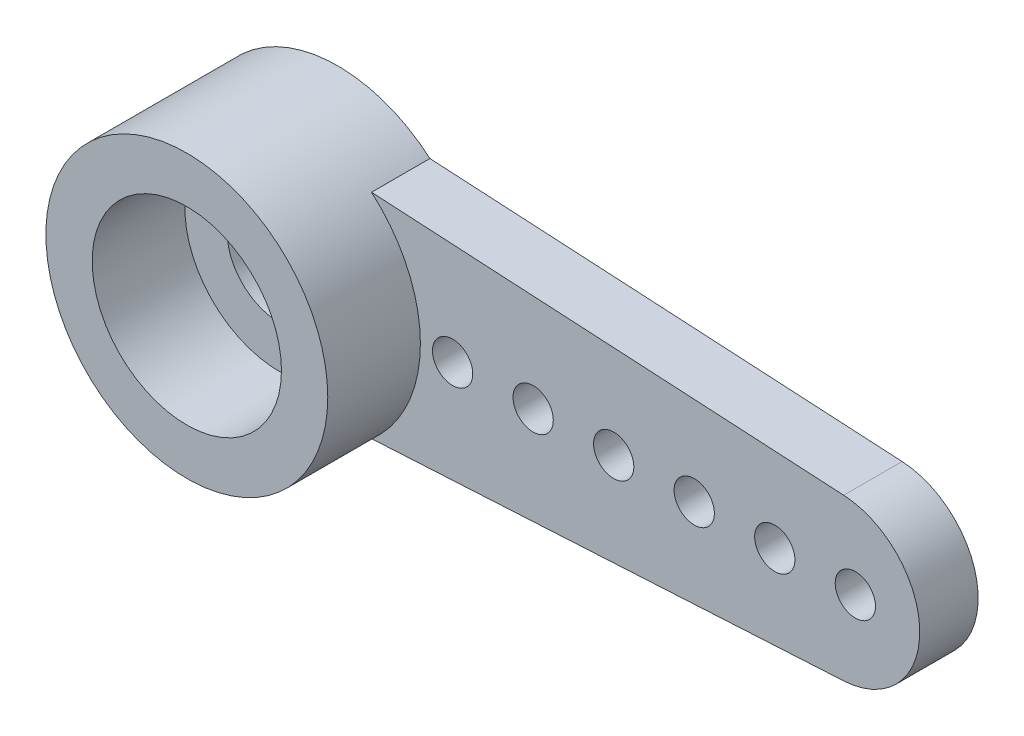
ISO-10303-21;
HEADER;
FILE_DESCRIPTION(('STEP AP214'),'2;1');
FILE_NAME('part.step','',(''),(''),'','','');
FILE_SCHEMA(('AUTOMOTIVE_DESIGN { 1 0 10303 214 1 1 1 1 }'));
ENDSEC;
DATA;
#1=APPLICATION_CONTEXT('core data for automotive mechanical design processes');
#2=APPLICATION_PROTOCOL_DEFINITION('international standard','automotive_design',2000,#1);
#3=PRODUCT_CONTEXT('',#1,'mechanical');
#4=PRODUCT('Part','Part','',(#3));
#5=PRODUCT_RELATED_PRODUCT_CATEGORY('part','',(#4));
#6=PRODUCT_DEFINITION_FORMATION('','',#4);
#7=PRODUCT_DEFINITION_CONTEXT('part definition',#1,'design');
#8=PRODUCT_DEFINITION('design','',#6,#7);
#9=PRODUCT_DEFINITION_SHAPE('','',#8);
#10=(LENGTH_UNIT() NAMED_UNIT(*) SI_UNIT(.MILLI.,.METRE.));
#11=(NAMED_UNIT(*) PLANE_ANGLE_UNIT() SI_UNIT($,.RADIAN.));
#12=(NAMED_UNIT(*) SI_UNIT($,.STERADIAN.) SOLID_ANGLE_UNIT());
#13=UNCERTAINTY_MEASURE_WITH_UNIT(LENGTH_MEASURE(1.E-05),#10,'distance_accuracy_value','');
#14=(GEOMETRIC_REPRESENTATION_CONTEXT(3) GLOBAL_UNCERTAINTY_ASSIGNED_CONTEXT((#13)) GLOBAL_UNIT_ASSIGNED_CONTEXT((#10,
#11,#12)) REPRESENTATION_CONTEXT('',''));
#15=CARTESIAN_POINT('',(0.,0.,0.));
#16=DIRECTION('',(0.,0.,1.));
#17=DIRECTION('',(1.,0.,0.));
#18=AXIS2_PLACEMENT_3D('',#15,#16,#17);
#19=CARTESIAN_POINT('',(4.3,0.,3.75));
#20=DIRECTION('',(0.,0.,-1.));
#21=DIRECTION('',(-1.,0.,0.));
#22=AXIS2_PLACEMENT_3D('',#19,#20,#21);
#23=CYLINDRICAL_SURFACE('',#22,0.500000000000001);
#24=CARTESIAN_POINT('',(4.3,0.,1.45));
#25=DIRECTION('',(0.,0.,1.));
#26=DIRECTION('',(1.,0.,0.));
#27=AXIS2_PLACEMENT_3D('',#24,#25,#26);
#28=CIRCLE('',#27,0.500000000000001);
#29=CARTESIAN_POINT('',(4.8,0.,1.45));
#30=VERTEX_POINT('',#29);
#31=EDGE_CURVE('E45',#30,#30,#28,.T.);
#32=ORIENTED_EDGE('',*,*,#31,.T.);
#33=EDGE_LOOP('',(#32));
#34=FACE_BOUND('',#33,.T.);
#35=CARTESIAN_POINT('',(4.3,0.,0.));
#36=DIRECTION('',(0.,0.,-1.));
#37=DIRECTION('',(-1.,0.,0.));
#38=AXIS2_PLACEMENT_3D('',#35,#36,#37);
#39=CIRCLE('',#38,0.500000000000001);
#40=CARTESIAN_POINT('',(3.8,0.,0.));
#41=VERTEX_POINT('',#40);
#42=EDGE_CURVE('E11',#41,#41,#39,.T.);
#43=ORIENTED_EDGE('',*,*,#42,.T.);
#44=EDGE_LOOP('',(#43));
#45=FACE_BOUND('',#44,.T.);
#46=ADVANCED_FACE('F37',(#34,#45),#23,.F.);
#47=CARTESIAN_POINT('',(6.3,0.,3.75));
#48=DIRECTION('',(0.,0.,-1.));
#49=DIRECTION('',(-1.,0.,0.));
#50=AXIS2_PLACEMENT_3D('',#47,#48,#49);
#51=CYLINDRICAL_SURFACE('',#50,0.500000000000001);
#52=CARTESIAN_POINT('',(6.3,0.,1.45));
#53=DIRECTION('',(0.,0.,1.));
#54=DIRECTION('',(1.,0.,0.));
#55=AXIS2_PLACEMENT_3D('',#52,#53,#54);
#56=CIRCLE('',#55,0.500000000000001);
#57=CARTESIAN_POINT('',(6.8,0.,1.45));
#58=VERTEX_POINT('',#57);
#59=EDGE_CURVE('E133',#58,#58,#56,.T.);
#60=ORIENTED_EDGE('',*,*,#59,.T.);
#61=EDGE_LOOP('',(#60));
#62=FACE_BOUND('',#61,.T.);
#63=CARTESIAN_POINT('',(6.3,0.,0.));
#64=DIRECTION('',(0.,0.,-1.));
#65=DIRECTION('',(-1.,0.,0.));
#66=AXIS2_PLACEMENT_3D('',#63,#64,#65);
#67=CIRCLE('',#66,0.500000000000001);
#68=CARTESIAN_POINT('',(5.8,0.,0.));
#69=VERTEX_POINT('',#68);
#70=EDGE_CURVE('E136',#69,#69,#67,.T.);
#71=ORIENTED_EDGE('',*,*,#70,.T.);
#72=EDGE_LOOP('',(#71));
#73=FACE_BOUND('',#72,.T.);
#74=ADVANCED_FACE('F165',(#62,#73),#51,.F.);
#75=CARTESIAN_POINT('',(8.3,0.,3.75));
#76=DIRECTION('',(0.,0.,-1.));
#77=DIRECTION('',(-1.,0.,0.));
#78=AXIS2_PLACEMENT_3D('',#75,#76,#77);
#79=CYLINDRICAL_SURFACE('',#78,0.500000000000001);
#80=CARTESIAN_POINT('',(8.3,0.,1.45));
#81=DIRECTION('',(0.,0.,1.));
#82=DIRECTION('',(1.,0.,0.));
#83=AXIS2_PLACEMENT_3D('',#80,#81,#82);
#84=CIRCLE('',#83,0.500000000000001);
#85=CARTESIAN_POINT('',(8.8,0.,1.45));
#86=VERTEX_POINT('',#85);
#87=EDGE_CURVE('E127',#86,#86,#84,.T.);
#88=ORIENTED_EDGE('',*,*,#87,.T.);
#89=EDGE_LOOP('',(#88));
#90=FACE_BOUND('',#89,.T.);
#91=CARTESIAN_POINT('',(8.3,0.,0.));
#92=DIRECTION('',(0.,0.,-1.));
#93=DIRECTION('',(-1.,0.,0.));
#94=AXIS2_PLACEMENT_3D('',#91,#92,#93);
#95=CIRCLE('',#94,0.500000000000001);
#96=CARTESIAN_POINT('',(7.8,0.,0.));
#97=VERTEX_POINT('',#96);
#98=EDGE_CURVE('E130',#97,#97,#95,.T.);
#99=ORIENTED_EDGE('',*,*,#98,.T.);
#100=EDGE_LOOP('',(#99));
#101=FACE_BOUND('',#100,.T.);
#102=ADVANCED_FACE('F169',(#90,#101),#79,.F.);
#103=CARTESIAN_POINT('',(10.3,0.,3.75));
#104=DIRECTION('',(0.,0.,-1.));
#105=DIRECTION('',(-1.,0.,0.));
#106=AXIS2_PLACEMENT_3D('',#103,#104,#105);
#107=CYLINDRICAL_SURFACE('',#106,0.500000000000001);
#108=CARTESIAN_POINT('',(10.3,0.,1.45));
#109=DIRECTION('',(0.,0.,1.));
#110=DIRECTION('',(1.,0.,0.));
#111=AXIS2_PLACEMENT_3D('',#108,#109,#110);
#112=CIRCLE('',#111,0.500000000000001);
#113=CARTESIAN_POINT('',(10.8,0.,1.45));
#114=VERTEX_POINT('',#113);
#115=EDGE_CURVE('E96',#114,#114,#112,.T.);
#116=ORIENTED_EDGE('',*,*,#115,.T.);
#117=EDGE_LOOP('',(#116));
#118=FACE_BOUND('',#117,.T.);
#119=CARTESIAN_POINT('',(10.3,0.,0.));
#120=DIRECTION('',(0.,0.,-1.));
#121=DIRECTION('',(-1.,0.,0.));
#122=AXIS2_PLACEMENT_3D('',#119,#120,#121);
#123=CIRCLE('',#122,0.500000000000001);
#124=CARTESIAN_POINT('',(9.8,0.,0.));
#125=VERTEX_POINT('',#124);
#126=EDGE_CURVE('E99',#125,#125,#123,.T.);
#127=ORIENTED_EDGE('',*,*,#126,.T.);
#128=EDGE_LOOP('',(#127));
#129=FACE_BOUND('',#128,.T.);
#130=ADVANCED_FACE('F174',(#118,#129),#107,.F.);
#131=CARTESIAN_POINT('',(0.,0.,1.45));
#132=DIRECTION('',(0.,0.,-1.));
#133=DIRECTION('',(-1.,0.,0.));
#134=AXIS2_PLACEMENT_3D('',#131,#132,#133);
#135=CYLINDRICAL_SURFACE('',#134,3.5);
#136=CARTESIAN_POINT('',(0.,0.,0.));
#137=DIRECTION('',(0.,0.,1.));
#138=DIRECTION('',(1.,0.,0.));
#139=AXIS2_PLACEMENT_3D('',#136,#137,#138);
#140=CIRCLE('',#139,3.5);
#141=CARTESIAN_POINT('',(2.28637267303473,2.65,0.));
#142=VERTEX_POINT('',#141);
#143=CARTESIAN_POINT('',(2.28637267303473,-2.65,0.));
#144=VERTEX_POINT('',#143);
#145=EDGE_CURVE('E110',#142,#144,#140,.T.);
#146=ORIENTED_EDGE('',*,*,#145,.T.);
#147=DIRECTION('',(0.,0.,-1.));
#148=VECTOR('',#147,1.);
#149=CARTESIAN_POINT('',(2.28637267303473,-2.65,1.45));
#150=LINE('',#149,#148);
#151=CARTESIAN_POINT('',(2.28637267303473,-2.65,1.45));
#152=VERTEX_POINT('',#151);
#153=EDGE_CURVE('E94',#152,#144,#150,.T.);
#154=ORIENTED_EDGE('',*,*,#153,.F.);
#155=CARTESIAN_POINT('',(0.,0.,1.45));
#156=DIRECTION('',(0.,0.,1.));
#157=DIRECTION('',(1.,0.,0.));
#158=AXIS2_PLACEMENT_3D('',#155,#156,#157);
#159=CIRCLE('',#158,3.5);
#160=CARTESIAN_POINT('',(2.28637267303473,2.65,1.45));
#161=VERTEX_POINT('',#160);
#162=EDGE_CURVE('E81',#152,#161,#159,.T.);
#163=ORIENTED_EDGE('',*,*,#162,.T.);
#164=DIRECTION('',(0.,0.,-1.));
#165=VECTOR('',#164,1.);
#166=CARTESIAN_POINT('',(2.28637267303473,2.65,1.45));
#167=LINE('',#166,#165);
#168=EDGE_CURVE('E78',#161,#142,#167,.T.);
#169=ORIENTED_EDGE('',*,*,#168,.T.);
#170=EDGE_LOOP('',(#146,#154,#163,#169));
#171=FACE_BOUND('',#170,.T.);
#172=CARTESIAN_POINT('',(0.,0.,3.75));
#173=DIRECTION('',(0.,0.,1.));
#174=DIRECTION('',(1.,0.,0.));
#175=AXIS2_PLACEMENT_3D('',#172,#173,#174);
#176=CIRCLE('',#175,3.5);
#177=CARTESIAN_POINT('',(3.5,0.,3.75));
#178=VERTEX_POINT('',#177);
#179=EDGE_CURVE('E105',#178,#178,#176,.T.);
#180=ORIENTED_EDGE('',*,*,#179,.F.);
#181=EDGE_LOOP('',(#180));
#182=FACE_BOUND('',#181,.T.);
#183=ADVANCED_FACE('F92',(#171,#182),#135,.T.);
#184=CARTESIAN_POINT('',(0.154225106367269,-2.7687644147367,1.45));
#185=DIRECTION('',(0.0556155679583172,-0.998452256545436,0.));
#186=DIRECTION('',(0.998452256545436,0.0556155679583172,0.));
#187=AXIS2_PLACEMENT_3D('',#184,#185,#186);
#188=PLANE('',#187);
#189=DIRECTION('',(-0.998452256545436,-0.0556155679583172,0.));
#190=VECTOR('',#189,1.);
#191=CARTESIAN_POINT('',(0.154225106367269,-2.7687644147367,0.));
#192=LINE('',#191,#190);
#193=CARTESIAN_POINT('',(14.0112311359166,-1.99690451309087,0.));
#194=VERTEX_POINT('',#193);
#195=EDGE_CURVE('E112',#194,#144,#192,.T.);
#196=ORIENTED_EDGE('',*,*,#195,.F.);
#197=DIRECTION('',(0.,0.,-1.));
#198=VECTOR('',#197,1.);
#199=CARTESIAN_POINT('',(14.0112311359166,-1.99690451309087,1.45));
#200=LINE('',#199,#198);
#201=CARTESIAN_POINT('',(14.0112311359166,-1.99690451309087,1.45));
#202=VERTEX_POINT('',#201);
#203=EDGE_CURVE('E101',#202,#194,#200,.T.);
#204=ORIENTED_EDGE('',*,*,#203,.F.);
#205=DIRECTION('',(-0.998452256545436,-0.0556155679583172,0.));
#206=VECTOR('',#205,1.);
#207=CARTESIAN_POINT('',(0.154225106367269,-2.7687644147367,1.45));
#208=LINE('',#207,#206);
#209=EDGE_CURVE('E107',#202,#152,#208,.T.);
#210=ORIENTED_EDGE('',*,*,#209,.T.);
#211=ORIENTED_EDGE('',*,*,#153,.T.);
#212=EDGE_LOOP('',(#196,#204,#210,#211));
#213=FACE_BOUND('',#212,.T.);
#214=ADVANCED_FACE('F184',(#213),#188,.T.);
#215=CARTESIAN_POINT('',(13.9,0.,1.45));
#216=DIRECTION('',(0.,0.,-1.));
#217=DIRECTION('',(-1.,0.,0.));
#218=AXIS2_PLACEMENT_3D('',#215,#216,#217);
#219=CYLINDRICAL_SURFACE('',#218,2.);
#220=CARTESIAN_POINT('',(13.9,0.,0.));
#221=DIRECTION('',(0.,0.,1.));
#222=DIRECTION('',(1.,0.,0.));
#223=AXIS2_PLACEMENT_3D('',#220,#221,#222);
#224=CIRCLE('',#223,2.);
#225=CARTESIAN_POINT('',(14.0112311359166,1.99690451309087,0.));
#226=VERTEX_POINT('',#225);
#227=EDGE_CURVE('E115',#194,#226,#224,.T.);
#228=ORIENTED_EDGE('',*,*,#227,.T.);
#229=DIRECTION('',(0.,0.,-1.));
#230=VECTOR('',#229,1.);
#231=CARTESIAN_POINT('',(14.0112311359166,1.99690451309087,1.45));
#232=LINE('',#231,#230);
#233=CARTESIAN_POINT('',(14.0112311359166,1.99690451309087,1.45));
#234=VERTEX_POINT('',#233);
#235=EDGE_CURVE('E71',#234,#226,#232,.T.);
#236=ORIENTED_EDGE('',*,*,#235,.F.);
#237=CARTESIAN_POINT('',(13.9,0.,1.45));
#238=DIRECTION('',(0.,0.,1.));
#239=DIRECTION('',(1.,0.,0.));
#240=AXIS2_PLACEMENT_3D('',#237,#238,#239);
#241=CIRCLE('',#240,2.);
#242=EDGE_CURVE('E53',#202,#234,#241,.T.);
#243=ORIENTED_EDGE('',*,*,#242,.F.);
#244=ORIENTED_EDGE('',*,*,#203,.T.);
#245=EDGE_LOOP('',(#228,#236,#243,#244));
#246=FACE_BOUND('',#245,.T.);
#247=ADVANCED_FACE('F155',(#246),#219,.T.);
#248=CARTESIAN_POINT('',(0.154225106367269,2.7687644147367,1.45));
#249=DIRECTION('',(0.0556155679583172,0.998452256545436,0.));
#250=DIRECTION('',(-0.998452256545436,0.0556155679583172,0.));
#251=AXIS2_PLACEMENT_3D('',#248,#249,#250);
#252=PLANE('',#251);
#253=DIRECTION('',(0.998452256545436,-0.0556155679583172,0.));
#254=VECTOR('',#253,1.);
#255=CARTESIAN_POINT('',(0.154225106367269,2.7687644147367,0.));
#256=LINE('',#255,#254);
#257=EDGE_CURVE('E90',#142,#226,#256,.T.);
#258=ORIENTED_EDGE('',*,*,#257,.F.);
#259=ORIENTED_EDGE('',*,*,#168,.F.);
#260=DIRECTION('',(0.998452256545436,-0.0556155679583172,0.));
#261=VECTOR('',#260,1.);
#262=CARTESIAN_POINT('',(0.154225106367269,2.7687644147367,1.45));
#263=LINE('',#262,#261);
#264=EDGE_CURVE('E84',#161,#234,#263,.T.);
#265=ORIENTED_EDGE('',*,*,#264,.T.);
#266=ORIENTED_EDGE('',*,*,#235,.T.);
#267=EDGE_LOOP('',(#258,#259,#265,#266));
#268=FACE_BOUND('',#267,.T.);
#269=ADVANCED_FACE('F88',(#268),#252,.T.);
#270=CARTESIAN_POINT('',(0.,0.,1.45));
#271=DIRECTION('',(0.,0.,1.));
#272=DIRECTION('',(1.,0.,0.));
#273=AXIS2_PLACEMENT_3D('',#270,#271,#272);
#274=PLANE('',#273);
#275=CARTESIAN_POINT('',(12.3,0.,1.45));
#276=DIRECTION('',(0.,0.,1.));
#277=DIRECTION('',(1.,0.,0.));
#278=AXIS2_PLACEMENT_3D('',#275,#276,#277);
#279=CIRCLE('',#278,0.500000000000001);
#280=CARTESIAN_POINT('',(12.8,0.,1.45));
#281=VERTEX_POINT('',#280);
#282=EDGE_CURVE('E336',#281,#281,#279,.T.);
#283=ORIENTED_EDGE('',*,*,#282,.F.);
#284=EDGE_LOOP('',(#283));
#285=FACE_BOUND('',#284,.T.);
#286=CARTESIAN_POINT('',(14.3,0.,1.45));
#287=DIRECTION('',(0.,0.,1.));
#288=DIRECTION('',(1.,0.,0.));
#289=AXIS2_PLACEMENT_3D('',#286,#287,#288);
#290=CIRCLE('',#289,0.500000000000001);
#291=CARTESIAN_POINT('',(14.8,0.,1.45));
#292=VERTEX_POINT('',#291);
#293=EDGE_CURVE('E343',#292,#292,#290,.T.);
#294=ORIENTED_EDGE('',*,*,#293,.F.);
#295=EDGE_LOOP('',(#294));
#296=FACE_BOUND('',#295,.T.);
#297=ORIENTED_EDGE('',*,*,#162,.F.);
#298=ORIENTED_EDGE('',*,*,#209,.F.);
#299=ORIENTED_EDGE('',*,*,#242,.T.);
#300=ORIENTED_EDGE('',*,*,#264,.F.);
#301=EDGE_LOOP('',(#297,#298,#299,#300));
#302=FACE_BOUND('',#301,.T.);
#303=ORIENTED_EDGE('',*,*,#115,.F.);
#304=EDGE_LOOP('',(#303));
#305=FACE_BOUND('',#304,.T.);
#306=ORIENTED_EDGE('',*,*,#87,.F.);
#307=EDGE_LOOP('',(#306));
#308=FACE_BOUND('',#307,.T.);
#309=ORIENTED_EDGE('',*,*,#59,.F.);
#310=EDGE_LOOP('',(#309));
#311=FACE_BOUND('',#310,.T.);
#312=ORIENTED_EDGE('',*,*,#31,.F.);
#313=EDGE_LOOP('',(#312));
#314=FACE_BOUND('',#313,.T.);
#315=ADVANCED_FACE('F85',(#285,#296,#302,#305,#308,#311,#314),#274,.T.);
#316=CARTESIAN_POINT('',(0.,0.,0.));
#317=DIRECTION('',(0.,0.,1.));
#318=DIRECTION('',(1.,0.,0.));
#319=AXIS2_PLACEMENT_3D('',#316,#317,#318);
#320=PLANE('',#319);
#321=CARTESIAN_POINT('',(12.3,0.,0.));
#322=DIRECTION('',(0.,0.,-1.));
#323=DIRECTION('',(-1.,0.,0.));
#324=AXIS2_PLACEMENT_3D('',#321,#322,#323);
#325=CIRCLE('',#324,0.500000000000001);
#326=CARTESIAN_POINT('',(11.8,0.,0.));
#327=VERTEX_POINT('',#326);
#328=EDGE_CURVE('E339',#327,#327,#325,.T.);
#329=ORIENTED_EDGE('',*,*,#328,.F.);
#330=EDGE_LOOP('',(#329));
#331=FACE_BOUND('',#330,.T.);
#332=CARTESIAN_POINT('',(14.3,0.,0.));
#333=DIRECTION('',(0.,0.,-1.));
#334=DIRECTION('',(-1.,0.,0.));
#335=AXIS2_PLACEMENT_3D('',#332,#333,#334);
#336=CIRCLE('',#335,0.500000000000001);
#337=CARTESIAN_POINT('',(13.8,0.,0.));
#338=VERTEX_POINT('',#337);
#339=EDGE_CURVE('E340',#338,#338,#336,.T.);
#340=ORIENTED_EDGE('',*,*,#339,.F.);
#341=EDGE_LOOP('',(#340));
#342=FACE_BOUND('',#341,.T.);
#343=CARTESIAN_POINT('',(0.,0.,0.));
#344=DIRECTION('',(0.,0.,-1.));
#345=DIRECTION('',(-1.,0.,0.));
#346=AXIS2_PLACEMENT_3D('',#343,#344,#345);
#347=CIRCLE('',#346,2.3);
#348=CARTESIAN_POINT('',(-2.3,0.,0.));
#349=VERTEX_POINT('',#348);
#350=EDGE_CURVE('E122',#349,#349,#347,.T.);
#351=ORIENTED_EDGE('',*,*,#350,.F.);
#352=EDGE_LOOP('',(#351));
#353=FACE_BOUND('',#352,.T.);
#354=ORIENTED_EDGE('',*,*,#145,.F.);
#355=ORIENTED_EDGE('',*,*,#257,.T.);
#356=ORIENTED_EDGE('',*,*,#227,.F.);
#357=ORIENTED_EDGE('',*,*,#195,.T.);
#358=EDGE_LOOP('',(#354,#355,#356,#357));
#359=FACE_BOUND('',#358,.T.);
#360=ORIENTED_EDGE('',*,*,#126,.F.);
#361=EDGE_LOOP('',(#360));
#362=FACE_BOUND('',#361,.T.);
#363=ORIENTED_EDGE('',*,*,#98,.F.);
#364=EDGE_LOOP('',(#363));
#365=FACE_BOUND('',#364,.T.);
#366=ORIENTED_EDGE('',*,*,#70,.F.);
#367=EDGE_LOOP('',(#366));
#368=FACE_BOUND('',#367,.T.);
#369=ORIENTED_EDGE('',*,*,#42,.F.);
#370=EDGE_LOOP('',(#369));
#371=FACE_BOUND('',#370,.T.);
#372=ADVANCED_FACE('F144',(#331,#342,#353,#359,#362,#365,#368,#371),#320,.F.);
#373=CARTESIAN_POINT('',(0.,0.,3.75));
#374=DIRECTION('',(0.,0.,1.));
#375=DIRECTION('',(1.,0.,0.));
#376=AXIS2_PLACEMENT_3D('',#373,#374,#375);
#377=PLANE('',#376);
#378=ORIENTED_EDGE('',*,*,#179,.T.);
#379=EDGE_LOOP('',(#378));
#380=FACE_BOUND('',#379,.T.);
#381=CARTESIAN_POINT('',(0.,0.,3.75));
#382=DIRECTION('',(0.,0.,1.));
#383=DIRECTION('',(1.,0.,0.));
#384=AXIS2_PLACEMENT_3D('',#381,#382,#383);
#385=CIRCLE('',#384,2.35);
#386=CARTESIAN_POINT('',(2.35,0.,3.75));
#387=VERTEX_POINT('',#386);
#388=EDGE_CURVE('E357',#387,#387,#385,.T.);
#389=ORIENTED_EDGE('',*,*,#388,.F.);
#390=EDGE_LOOP('',(#389));
#391=FACE_BOUND('',#390,.T.);
#392=ADVANCED_FACE('F152',(#380,#391),#377,.T.);
#393=CARTESIAN_POINT('',(0.,0.,3.75));
#394=DIRECTION('',(0.,0.,-1.));
#395=DIRECTION('',(-1.,0.,0.));
#396=AXIS2_PLACEMENT_3D('',#393,#394,#395);
#397=CYLINDRICAL_SURFACE('',#396,2.35);
#398=ORIENTED_EDGE('',*,*,#388,.T.);
#399=EDGE_LOOP('',(#398));
#400=FACE_BOUND('',#399,.T.);
#401=CARTESIAN_POINT('',(0.,0.,1.45));
#402=DIRECTION('',(0.,0.,1.));
#403=DIRECTION('',(1.,0.,0.));
#404=AXIS2_PLACEMENT_3D('',#401,#402,#403);
#405=CIRCLE('',#404,2.35);
#406=CARTESIAN_POINT('',(2.35,0.,1.45));
#407=VERTEX_POINT('',#406);
#408=EDGE_CURVE('E354',#407,#407,#405,.T.);
#409=ORIENTED_EDGE('',*,*,#408,.F.);
#410=EDGE_LOOP('',(#409));
#411=FACE_BOUND('',#410,.T.);
#412=ADVANCED_FACE('F162',(#400,#411),#397,.F.);
#413=CARTESIAN_POINT('',(0.,0.,1.45));
#414=DIRECTION('',(0.,0.,1.));
#415=DIRECTION('',(1.,0.,0.));
#416=AXIS2_PLACEMENT_3D('',#413,#414,#415);
#417=CIRCLE('',#416,1.3);
#418=CARTESIAN_POINT('',(1.3,0.,1.45));
#419=VERTEX_POINT('',#418);
#420=EDGE_CURVE('E120',#419,#419,#417,.T.);
#421=ORIENTED_EDGE('',*,*,#420,.F.);
#422=EDGE_LOOP('',(#421));
#423=FACE_BOUND('',#422,.T.);
#424=ORIENTED_EDGE('',*,*,#408,.T.);
#425=EDGE_LOOP('',(#424));
#426=FACE_BOUND('',#425,.T.);
#427=ADVANCED_FACE('F147',(#423,#426),#274,.T.);
#428=CARTESIAN_POINT('',(0.,0.,0.7));
#429=DIRECTION('',(0.,0.,-1.));
#430=DIRECTION('',(-1.,0.,0.));
#431=AXIS2_PLACEMENT_3D('',#428,#429,#430);
#432=CYLINDRICAL_SURFACE('',#431,2.3);
#433=CARTESIAN_POINT('',(0.,0.,0.7));
#434=DIRECTION('',(0.,0.,-1.));
#435=DIRECTION('',(-1.,0.,0.));
#436=AXIS2_PLACEMENT_3D('',#433,#434,#435);
#437=CIRCLE('',#436,2.3);
#438=CARTESIAN_POINT('',(-2.3,0.,0.7));
#439=VERTEX_POINT('',#438);
#440=EDGE_CURVE('E351',#439,#439,#437,.T.);
#441=ORIENTED_EDGE('',*,*,#440,.F.);
#442=EDGE_LOOP('',(#441));
#443=FACE_BOUND('',#442,.T.);
#444=ORIENTED_EDGE('',*,*,#350,.T.);
#445=EDGE_LOOP('',(#444));
#446=FACE_BOUND('',#445,.T.);
#447=ADVANCED_FACE('F161',(#443,#446),#432,.F.);
#448=CARTESIAN_POINT('',(0.,0.,0.7));
#449=DIRECTION('',(0.,0.,-1.));
#450=DIRECTION('',(-1.,0.,0.));
#451=AXIS2_PLACEMENT_3D('',#448,#449,#450);
#452=PLANE('',#451);
#453=CARTESIAN_POINT('',(0.,0.,0.7));
#454=DIRECTION('',(0.,0.,-1.));
#455=DIRECTION('',(-1.,0.,0.));
#456=AXIS2_PLACEMENT_3D('',#453,#454,#455);
#457=CIRCLE('',#456,1.3);
#458=CARTESIAN_POINT('',(-1.3,0.,0.7));
#459=VERTEX_POINT('',#458);
#460=EDGE_CURVE('E123',#459,#459,#457,.T.);
#461=ORIENTED_EDGE('',*,*,#460,.F.);
#462=EDGE_LOOP('',(#461));
#463=FACE_BOUND('',#462,.T.);
#464=ORIENTED_EDGE('',*,*,#440,.T.);
#465=EDGE_LOOP('',(#464));
#466=FACE_BOUND('',#465,.T.);
#467=ADVANCED_FACE('F250',(#463,#466),#452,.T.);
#468=CARTESIAN_POINT('',(0.,0.,3.75));
#469=DIRECTION('',(0.,0.,-1.));
#470=DIRECTION('',(-1.,0.,0.));
#471=AXIS2_PLACEMENT_3D('',#468,#469,#470);
#472=CYLINDRICAL_SURFACE('',#471,1.3);
#473=ORIENTED_EDGE('',*,*,#420,.T.);
#474=EDGE_LOOP('',(#473));
#475=FACE_BOUND('',#474,.T.);
#476=ORIENTED_EDGE('',*,*,#460,.T.);
#477=EDGE_LOOP('',(#476));
#478=FACE_BOUND('',#477,.T.);
#479=ADVANCED_FACE('F266',(#475,#478),#472,.F.);
#480=CARTESIAN_POINT('',(14.3,0.,3.75));
#481=DIRECTION('',(0.,0.,-1.));
#482=DIRECTION('',(-1.,0.,0.));
#483=AXIS2_PLACEMENT_3D('',#480,#481,#482);
#484=CYLINDRICAL_SURFACE('',#483,0.500000000000001);
#485=ORIENTED_EDGE('',*,*,#293,.T.);
#486=EDGE_LOOP('',(#485));
#487=FACE_BOUND('',#486,.T.);
#488=ORIENTED_EDGE('',*,*,#339,.T.);
#489=EDGE_LOOP('',(#488));
#490=FACE_BOUND('',#489,.T.);
#491=ADVANCED_FACE('F276',(#487,#490),#484,.F.);
#492=CARTESIAN_POINT('',(12.3,0.,3.75));
#493=DIRECTION('',(0.,0.,-1.));
#494=DIRECTION('',(-1.,0.,0.));
#495=AXIS2_PLACEMENT_3D('',#492,#493,#494);
#496=CYLINDRICAL_SURFACE('',#495,0.500000000000001);
#497=ORIENTED_EDGE('',*,*,#282,.T.);
#498=EDGE_LOOP('',(#497));
#499=FACE_BOUND('',#498,.T.);
#500=ORIENTED_EDGE('',*,*,#328,.T.);
#501=EDGE_LOOP('',(#500));
#502=FACE_BOUND('',#501,.T.);
#503=ADVANCED_FACE('F285',(#499,#502),#496,.F.);
#504=CLOSED_SHELL('',(#46,#74,#102,#130,#183,#214,#247,#269,#315,#372,#392,#412,#427,#447,#467,
#479,#491,#503));
#505=MANIFOLD_SOLID_BREP('B2',#504);
#506=ADVANCED_BREP_SHAPE_REPRESENTATION('',(#18,#505),#14);
#507=SHAPE_DEFINITION_REPRESENTATION(#9,#506);
ENDSEC;
END-ISO-10303-21;
